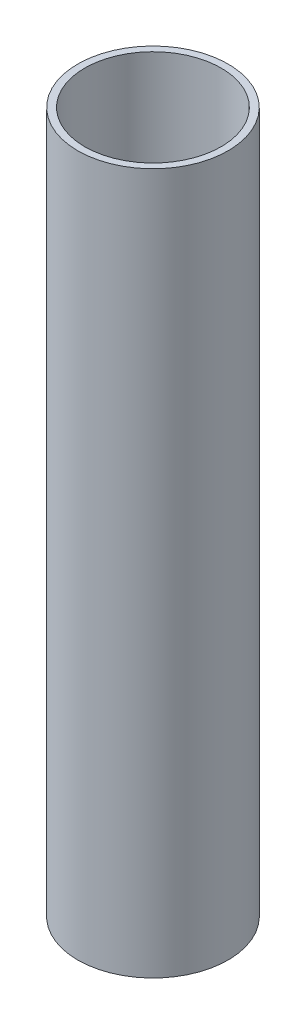
ISO-10303-21;
HEADER;
FILE_DESCRIPTION(('STEP AP214'),'2;1');
FILE_NAME('part.step','',(''),(''),'','','');
FILE_SCHEMA(('AUTOMOTIVE_DESIGN { 1 0 10303 214 1 1 1 1 }'));
ENDSEC;
DATA;
#1=APPLICATION_CONTEXT('core data for automotive mechanical design processes');
#2=APPLICATION_PROTOCOL_DEFINITION('international standard','automotive_design',2000,#1);
#3=PRODUCT_CONTEXT('',#1,'mechanical');
#4=PRODUCT('Part','Part','',(#3));
#5=PRODUCT_RELATED_PRODUCT_CATEGORY('part','',(#4));
#6=PRODUCT_DEFINITION_FORMATION('','',#4);
#7=PRODUCT_DEFINITION_CONTEXT('part definition',#1,'design');
#8=PRODUCT_DEFINITION('design','',#6,#7);
#9=PRODUCT_DEFINITION_SHAPE('','',#8);
#10=(LENGTH_UNIT() NAMED_UNIT(*) SI_UNIT(.MILLI.,.METRE.));
#11=(NAMED_UNIT(*) PLANE_ANGLE_UNIT() SI_UNIT($,.RADIAN.));
#12=(NAMED_UNIT(*) SI_UNIT($,.STERADIAN.) SOLID_ANGLE_UNIT());
#13=UNCERTAINTY_MEASURE_WITH_UNIT(LENGTH_MEASURE(1.E-05),#10,'distance_accuracy_value','');
#14=(GEOMETRIC_REPRESENTATION_CONTEXT(3) GLOBAL_UNCERTAINTY_ASSIGNED_CONTEXT((#13)) GLOBAL_UNIT_ASSIGNED_CONTEXT((#10,
#11,#12)) REPRESENTATION_CONTEXT('',''));
#15=CARTESIAN_POINT('',(0.,0.,0.));
#16=DIRECTION('',(0.,0.,1.));
#17=DIRECTION('',(1.,0.,0.));
#18=AXIS2_PLACEMENT_3D('',#15,#16,#17);
#19=CARTESIAN_POINT('',(0.,5.22,0.));
#20=DIRECTION('',(0.,1.,0.));
#21=DIRECTION('',(0.,0.,1.));
#22=AXIS2_PLACEMENT_3D('',#19,#20,#21);
#23=PLANE('',#22);
#24=CARTESIAN_POINT('',(0.,5.22,0.));
#25=DIRECTION('',(0.,1.,0.));
#26=DIRECTION('',(0.,0.,1.));
#27=AXIS2_PLACEMENT_3D('',#24,#25,#26);
#28=CIRCLE('',#27,0.56);
#29=CARTESIAN_POINT('',(0.,5.22,0.56));
#30=VERTEX_POINT('',#29);
#31=EDGE_CURVE('E10',#30,#30,#28,.T.);
#32=ORIENTED_EDGE('',*,*,#31,.T.);
#33=EDGE_LOOP('',(#32));
#34=FACE_BOUND('',#33,.T.);
#35=CARTESIAN_POINT('',(0.,5.22,0.));
#36=DIRECTION('',(0.,1.,0.));
#37=DIRECTION('',(0.,0.,1.));
#38=AXIS2_PLACEMENT_3D('',#35,#36,#37);
#39=CIRCLE('',#38,0.508);
#40=CARTESIAN_POINT('',(0.,5.22,0.508));
#41=VERTEX_POINT('',#40);
#42=EDGE_CURVE('E43',#41,#41,#39,.T.);
#43=ORIENTED_EDGE('',*,*,#42,.F.);
#44=EDGE_LOOP('',(#43));
#45=FACE_BOUND('',#44,.T.);
#46=ADVANCED_FACE('F32',(#34,#45),#23,.T.);
#47=CARTESIAN_POINT('',(0.,0.,0.));
#48=DIRECTION('',(0.,1.,0.));
#49=DIRECTION('',(0.,0.,1.));
#50=AXIS2_PLACEMENT_3D('',#47,#48,#49);
#51=PLANE('',#50);
#52=CARTESIAN_POINT('',(0.,0.,0.));
#53=DIRECTION('',(0.,1.,0.));
#54=DIRECTION('',(0.,0.,1.));
#55=AXIS2_PLACEMENT_3D('',#52,#53,#54);
#56=CIRCLE('',#55,0.56);
#57=CARTESIAN_POINT('',(0.,0.,0.56));
#58=VERTEX_POINT('',#57);
#59=EDGE_CURVE('E36',#58,#58,#56,.T.);
#60=ORIENTED_EDGE('',*,*,#59,.F.);
#61=EDGE_LOOP('',(#60));
#62=FACE_BOUND('',#61,.T.);
#63=CARTESIAN_POINT('',(0.,0.,0.));
#64=DIRECTION('',(0.,1.,0.));
#65=DIRECTION('',(0.,0.,1.));
#66=AXIS2_PLACEMENT_3D('',#63,#64,#65);
#67=CIRCLE('',#66,0.508);
#68=CARTESIAN_POINT('',(0.,0.,0.508));
#69=VERTEX_POINT('',#68);
#70=EDGE_CURVE('E45',#69,#69,#67,.T.);
#71=ORIENTED_EDGE('',*,*,#70,.T.);
#72=EDGE_LOOP('',(#71));
#73=FACE_BOUND('',#72,.T.);
#74=ADVANCED_FACE('F55',(#62,#73),#51,.F.);
#75=CARTESIAN_POINT('',(0.,5.22,0.));
#76=DIRECTION('',(0.,-1.,0.));
#77=DIRECTION('',(0.,0.,-1.));
#78=AXIS2_PLACEMENT_3D('',#75,#76,#77);
#79=CYLINDRICAL_SURFACE('',#78,0.56);
#80=ORIENTED_EDGE('',*,*,#31,.F.);
#81=EDGE_LOOP('',(#80));
#82=FACE_BOUND('',#81,.T.);
#83=ORIENTED_EDGE('',*,*,#59,.T.);
#84=EDGE_LOOP('',(#83));
#85=FACE_BOUND('',#84,.T.);
#86=ADVANCED_FACE('F34',(#82,#85),#79,.T.);
#87=CARTESIAN_POINT('',(0.,5.22,0.));
#88=DIRECTION('',(0.,-1.,0.));
#89=DIRECTION('',(0.,0.,-1.));
#90=AXIS2_PLACEMENT_3D('',#87,#88,#89);
#91=CYLINDRICAL_SURFACE('',#90,0.508);
#92=ORIENTED_EDGE('',*,*,#42,.T.);
#93=EDGE_LOOP('',(#92));
#94=FACE_BOUND('',#93,.T.);
#95=ORIENTED_EDGE('',*,*,#70,.F.);
#96=EDGE_LOOP('',(#95));
#97=FACE_BOUND('',#96,.T.);
#98=ADVANCED_FACE('F51',(#94,#97),#91,.F.);
#99=CLOSED_SHELL('',(#46,#74,#86,#98));
#100=MANIFOLD_SOLID_BREP('B2',#99);
#101=ADVANCED_BREP_SHAPE_REPRESENTATION('',(#18,#100),#14);
#102=SHAPE_DEFINITION_REPRESENTATION(#9,#101);
ENDSEC;
END-ISO-10303-21;
